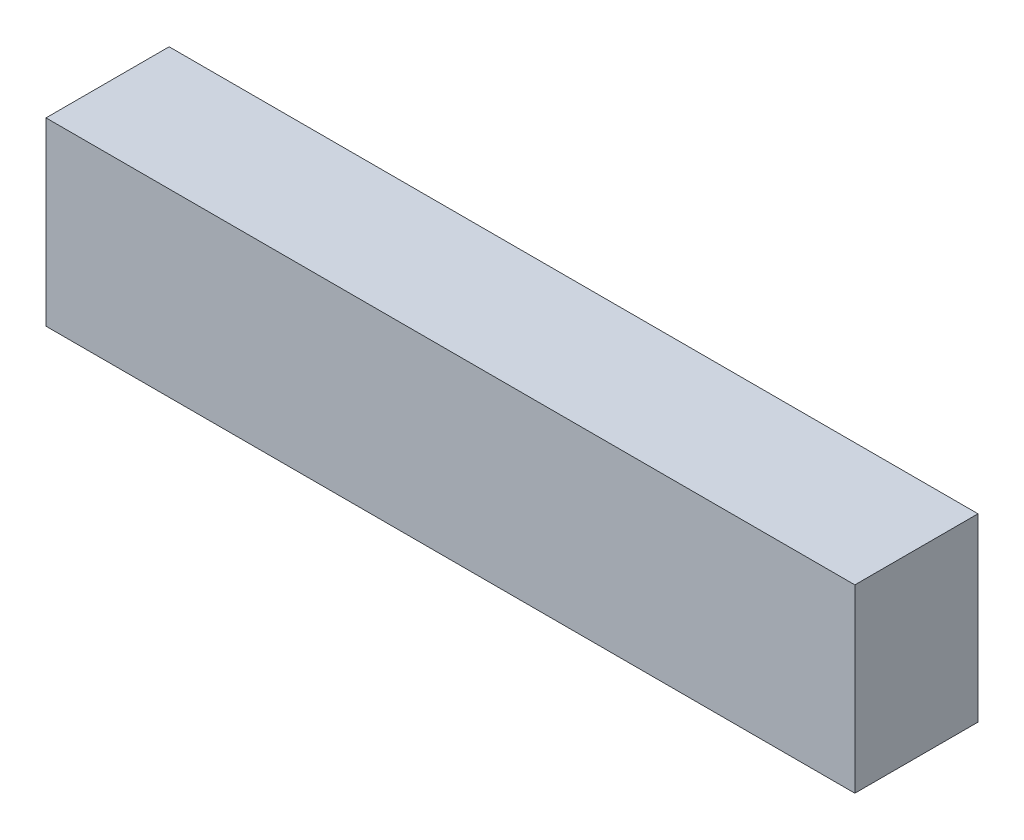
ISO-10303-21;
HEADER;
FILE_DESCRIPTION(('STEP AP214'),'2;1');
FILE_NAME('part.step','',(''),(''),'','','');
FILE_SCHEMA(('AUTOMOTIVE_DESIGN { 1 0 10303 214 1 1 1 1 }'));
ENDSEC;
DATA;
#1=APPLICATION_CONTEXT('core data for automotive mechanical design processes');
#2=APPLICATION_PROTOCOL_DEFINITION('international standard','automotive_design',2000,#1);
#3=PRODUCT_CONTEXT('',#1,'mechanical');
#4=PRODUCT('Part','Part','',(#3));
#5=PRODUCT_RELATED_PRODUCT_CATEGORY('part','',(#4));
#6=PRODUCT_DEFINITION_FORMATION('','',#4);
#7=PRODUCT_DEFINITION_CONTEXT('part definition',#1,'design');
#8=PRODUCT_DEFINITION('design','',#6,#7);
#9=PRODUCT_DEFINITION_SHAPE('','',#8);
#10=(LENGTH_UNIT() NAMED_UNIT(*) SI_UNIT(.MILLI.,.METRE.));
#11=(NAMED_UNIT(*) PLANE_ANGLE_UNIT() SI_UNIT($,.RADIAN.));
#12=(NAMED_UNIT(*) SI_UNIT($,.STERADIAN.) SOLID_ANGLE_UNIT());
#13=UNCERTAINTY_MEASURE_WITH_UNIT(LENGTH_MEASURE(1.E-05),#10,'distance_accuracy_value','');
#14=(GEOMETRIC_REPRESENTATION_CONTEXT(3) GLOBAL_UNCERTAINTY_ASSIGNED_CONTEXT((#13)) GLOBAL_UNIT_ASSIGNED_CONTEXT((#10,
#11,#12)) REPRESENTATION_CONTEXT('',''));
#15=CARTESIAN_POINT('',(0.,0.,0.));
#16=DIRECTION('',(0.,0.,1.));
#17=DIRECTION('',(1.,0.,0.));
#18=AXIS2_PLACEMENT_3D('',#15,#16,#17);
#19=CARTESIAN_POINT('',(19.05,8.5,2.9));
#20=DIRECTION('',(-1.,0.,0.));
#21=DIRECTION('',(0.,0.,1.));
#22=AXIS2_PLACEMENT_3D('',#19,#20,#21);
#23=PLANE('',#22);
#24=DIRECTION('',(0.,0.,-1.));
#25=VECTOR('',#24,1.);
#26=CARTESIAN_POINT('',(19.05,0.,2.9));
#27=LINE('',#26,#25);
#28=CARTESIAN_POINT('',(19.05,0.,2.9));
#29=VERTEX_POINT('',#28);
#30=CARTESIAN_POINT('',(19.05,0.,-2.9));
#31=VERTEX_POINT('',#30);
#32=EDGE_CURVE('E113',#29,#31,#27,.T.);
#33=ORIENTED_EDGE('',*,*,#32,.T.);
#34=DIRECTION('',(0.,-1.,0.));
#35=VECTOR('',#34,1.);
#36=CARTESIAN_POINT('',(19.05,8.5,-2.9));
#37=LINE('',#36,#35);
#38=CARTESIAN_POINT('',(19.05,8.5,-2.9));
#39=VERTEX_POINT('',#38);
#40=EDGE_CURVE('E11',#39,#31,#37,.T.);
#41=ORIENTED_EDGE('',*,*,#40,.F.);
#42=DIRECTION('',(0.,0.,-1.));
#43=VECTOR('',#42,1.);
#44=CARTESIAN_POINT('',(19.05,8.5,2.9));
#45=LINE('',#44,#43);
#46=CARTESIAN_POINT('',(19.05,8.5,2.9));
#47=VERTEX_POINT('',#46);
#48=EDGE_CURVE('E97',#47,#39,#45,.T.);
#49=ORIENTED_EDGE('',*,*,#48,.F.);
#50=DIRECTION('',(0.,-1.,0.));
#51=VECTOR('',#50,1.);
#52=CARTESIAN_POINT('',(19.05,8.5,2.9));
#53=LINE('',#52,#51);
#54=EDGE_CURVE('E109',#47,#29,#53,.T.);
#55=ORIENTED_EDGE('',*,*,#54,.T.);
#56=EDGE_LOOP('',(#33,#41,#49,#55));
#57=FACE_BOUND('',#56,.T.);
#58=ADVANCED_FACE('F45',(#57),#23,.F.);
#59=CARTESIAN_POINT('',(-19.05,8.5,-2.9));
#60=DIRECTION('',(0.,0.,1.));
#61=DIRECTION('',(1.,0.,0.));
#62=AXIS2_PLACEMENT_3D('',#59,#60,#61);
#63=PLANE('',#62);
#64=DIRECTION('',(-1.,0.,0.));
#65=VECTOR('',#64,1.);
#66=CARTESIAN_POINT('',(-19.05,0.,-2.9));
#67=LINE('',#66,#65);
#68=CARTESIAN_POINT('',(-19.05,0.,-2.9));
#69=VERTEX_POINT('',#68);
#70=EDGE_CURVE('E102',#31,#69,#67,.T.);
#71=ORIENTED_EDGE('',*,*,#70,.T.);
#72=DIRECTION('',(0.,-1.,0.));
#73=VECTOR('',#72,1.);
#74=CARTESIAN_POINT('',(-19.05,8.5,-2.9));
#75=LINE('',#74,#73);
#76=CARTESIAN_POINT('',(-19.05,8.5,-2.9));
#77=VERTEX_POINT('',#76);
#78=EDGE_CURVE('E54',#77,#69,#75,.T.);
#79=ORIENTED_EDGE('',*,*,#78,.F.);
#80=DIRECTION('',(-1.,0.,0.));
#81=VECTOR('',#80,1.);
#82=CARTESIAN_POINT('',(-19.05,8.5,-2.9));
#83=LINE('',#82,#81);
#84=EDGE_CURVE('E92',#39,#77,#83,.T.);
#85=ORIENTED_EDGE('',*,*,#84,.F.);
#86=ORIENTED_EDGE('',*,*,#40,.T.);
#87=EDGE_LOOP('',(#71,#79,#85,#86));
#88=FACE_BOUND('',#87,.T.);
#89=ADVANCED_FACE('F101',(#88),#63,.F.);
#90=CARTESIAN_POINT('',(-19.05,8.5,2.9));
#91=DIRECTION('',(1.,0.,0.));
#92=DIRECTION('',(0.,0.,-1.));
#93=AXIS2_PLACEMENT_3D('',#90,#91,#92);
#94=PLANE('',#93);
#95=DIRECTION('',(0.,0.,1.));
#96=VECTOR('',#95,1.);
#97=CARTESIAN_POINT('',(-19.05,0.,2.9));
#98=LINE('',#97,#96);
#99=CARTESIAN_POINT('',(-19.05,0.,2.9));
#100=VERTEX_POINT('',#99);
#101=EDGE_CURVE('E79',#69,#100,#98,.T.);
#102=ORIENTED_EDGE('',*,*,#101,.T.);
#103=DIRECTION('',(0.,-1.,0.));
#104=VECTOR('',#103,1.);
#105=CARTESIAN_POINT('',(-19.05,8.5,2.9));
#106=LINE('',#105,#104);
#107=CARTESIAN_POINT('',(-19.05,8.5,2.9));
#108=VERTEX_POINT('',#107);
#109=EDGE_CURVE('E104',#108,#100,#106,.T.);
#110=ORIENTED_EDGE('',*,*,#109,.F.);
#111=DIRECTION('',(0.,0.,1.));
#112=VECTOR('',#111,1.);
#113=CARTESIAN_POINT('',(-19.05,8.5,2.9));
#114=LINE('',#113,#112);
#115=EDGE_CURVE('E95',#77,#108,#114,.T.);
#116=ORIENTED_EDGE('',*,*,#115,.F.);
#117=ORIENTED_EDGE('',*,*,#78,.T.);
#118=EDGE_LOOP('',(#102,#110,#116,#117));
#119=FACE_BOUND('',#118,.T.);
#120=ADVANCED_FACE('F105',(#119),#94,.F.);
#121=CARTESIAN_POINT('',(-19.05,8.5,2.9));
#122=DIRECTION('',(0.,0.,-1.));
#123=DIRECTION('',(-1.,0.,0.));
#124=AXIS2_PLACEMENT_3D('',#121,#122,#123);
#125=PLANE('',#124);
#126=DIRECTION('',(1.,0.,0.));
#127=VECTOR('',#126,1.);
#128=CARTESIAN_POINT('',(-19.05,0.,2.9));
#129=LINE('',#128,#127);
#130=EDGE_CURVE('E85',#100,#29,#129,.T.);
#131=ORIENTED_EDGE('',*,*,#130,.T.);
#132=ORIENTED_EDGE('',*,*,#54,.F.);
#133=DIRECTION('',(1.,0.,0.));
#134=VECTOR('',#133,1.);
#135=CARTESIAN_POINT('',(-19.05,8.5,2.9));
#136=LINE('',#135,#134);
#137=EDGE_CURVE('E62',#108,#47,#136,.T.);
#138=ORIENTED_EDGE('',*,*,#137,.F.);
#139=ORIENTED_EDGE('',*,*,#109,.T.);
#140=EDGE_LOOP('',(#131,#132,#138,#139));
#141=FACE_BOUND('',#140,.T.);
#142=ADVANCED_FACE('F126',(#141),#125,.F.);
#143=CARTESIAN_POINT('',(0.,8.5,0.));
#144=DIRECTION('',(0.,-1.,0.));
#145=DIRECTION('',(0.,0.,-1.));
#146=AXIS2_PLACEMENT_3D('',#143,#144,#145);
#147=PLANE('',#146);
#148=ORIENTED_EDGE('',*,*,#48,.T.);
#149=ORIENTED_EDGE('',*,*,#84,.T.);
#150=ORIENTED_EDGE('',*,*,#115,.T.);
#151=ORIENTED_EDGE('',*,*,#137,.T.);
#152=EDGE_LOOP('',(#148,#149,#150,#151));
#153=FACE_BOUND('',#152,.T.);
#154=ADVANCED_FACE('F93',(#153),#147,.F.);
#155=CARTESIAN_POINT('',(0.,0.,0.));
#156=DIRECTION('',(0.,-1.,0.));
#157=DIRECTION('',(0.,0.,-1.));
#158=AXIS2_PLACEMENT_3D('',#155,#156,#157);
#159=PLANE('',#158);
#160=ORIENTED_EDGE('',*,*,#32,.F.);
#161=ORIENTED_EDGE('',*,*,#130,.F.);
#162=ORIENTED_EDGE('',*,*,#101,.F.);
#163=ORIENTED_EDGE('',*,*,#70,.F.);
#164=EDGE_LOOP('',(#160,#161,#162,#163));
#165=FACE_BOUND('',#164,.T.);
#166=ADVANCED_FACE('F129',(#165),#159,.T.);
#167=CLOSED_SHELL('',(#58,#89,#120,#142,#154,#166));
#168=MANIFOLD_SOLID_BREP('B2',#167);
#169=ADVANCED_BREP_SHAPE_REPRESENTATION('',(#18,#168),#14);
#170=SHAPE_DEFINITION_REPRESENTATION(#9,#169);
ENDSEC;
END-ISO-10303-21;
